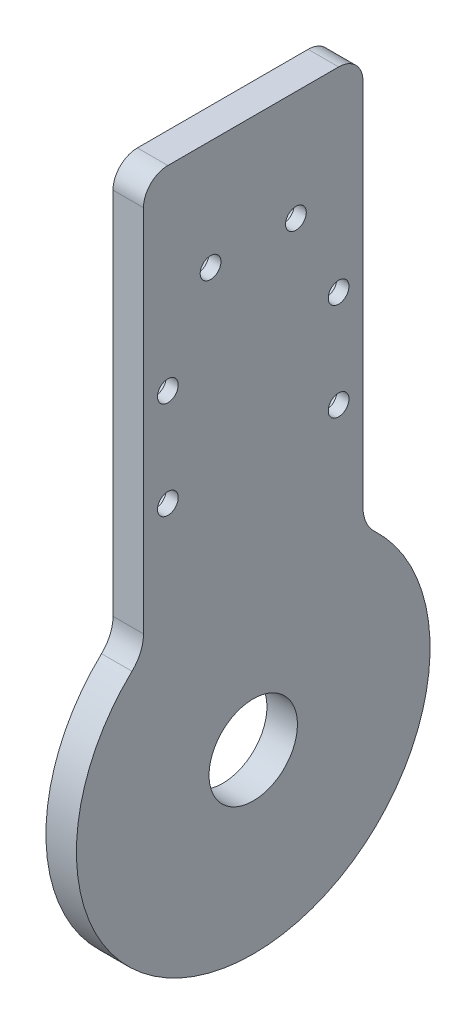
ISO-10303-21;
HEADER;
FILE_DESCRIPTION(('STEP AP214'),'2;1');
FILE_NAME('part.step','',(''),(''),'','','');
FILE_SCHEMA(('AUTOMOTIVE_DESIGN { 1 0 10303 214 1 1 1 1 }'));
ENDSEC;
DATA;
#1=APPLICATION_CONTEXT('core data for automotive mechanical design processes');
#2=APPLICATION_PROTOCOL_DEFINITION('international standard','automotive_design',2000,#1);
#3=PRODUCT_CONTEXT('',#1,'mechanical');
#4=PRODUCT('Part','Part','',(#3));
#5=PRODUCT_RELATED_PRODUCT_CATEGORY('part','',(#4));
#6=PRODUCT_DEFINITION_FORMATION('','',#4);
#7=PRODUCT_DEFINITION_CONTEXT('part definition',#1,'design');
#8=PRODUCT_DEFINITION('design','',#6,#7);
#9=PRODUCT_DEFINITION_SHAPE('','',#8);
#10=(LENGTH_UNIT() NAMED_UNIT(*) SI_UNIT(.MILLI.,.METRE.));
#11=(NAMED_UNIT(*) PLANE_ANGLE_UNIT() SI_UNIT($,.RADIAN.));
#12=(NAMED_UNIT(*) SI_UNIT($,.STERADIAN.) SOLID_ANGLE_UNIT());
#13=UNCERTAINTY_MEASURE_WITH_UNIT(LENGTH_MEASURE(1.E-05),#10,'distance_accuracy_value','');
#14=(GEOMETRIC_REPRESENTATION_CONTEXT(3) GLOBAL_UNCERTAINTY_ASSIGNED_CONTEXT((#13)) GLOBAL_UNIT_ASSIGNED_CONTEXT((#10,
#11,#12)) REPRESENTATION_CONTEXT('',''));
#15=CARTESIAN_POINT('',(0.,0.,0.));
#16=DIRECTION('',(0.,0.,1.));
#17=DIRECTION('',(1.,0.,0.));
#18=AXIS2_PLACEMENT_3D('',#15,#16,#17);
#19=CARTESIAN_POINT('',(-28.55,227.975478405714,-10.));
#20=DIRECTION('',(1.,0.,0.));
#21=DIRECTION('',(0.,0.,-1.));
#22=AXIS2_PLACEMENT_3D('',#19,#20,#21);
#23=PLANE('',#22);
#24=CARTESIAN_POINT('',(-28.55,274.5,7.));
#25=DIRECTION('',(1.,0.,0.));
#26=DIRECTION('',(0.,0.,-1.));
#27=AXIS2_PLACEMENT_3D('',#24,#25,#26);
#28=CIRCLE('',#27,1.7);
#29=CARTESIAN_POINT('',(-28.55,274.5,5.3));
#30=VERTEX_POINT('',#29);
#31=EDGE_CURVE('E225',#30,#30,#28,.F.);
#32=ORIENTED_EDGE('',*,*,#31,.T.);
#33=EDGE_LOOP('',(#32));
#34=FACE_BOUND('',#33,.T.);
#35=CARTESIAN_POINT('',(-28.55,260.5,28.));
#36=DIRECTION('',(1.,0.,0.));
#37=DIRECTION('',(0.,0.,-1.));
#38=AXIS2_PLACEMENT_3D('',#35,#36,#37);
#39=CIRCLE('',#38,1.7);
#40=CARTESIAN_POINT('',(-28.55,260.5,26.3));
#41=VERTEX_POINT('',#40);
#42=EDGE_CURVE('E218',#41,#41,#39,.F.);
#43=ORIENTED_EDGE('',*,*,#42,.T.);
#44=EDGE_LOOP('',(#43));
#45=FACE_BOUND('',#44,.T.);
#46=CARTESIAN_POINT('',(-28.55,260.5,0.));
#47=DIRECTION('',(1.,0.,0.));
#48=DIRECTION('',(0.,0.,-1.));
#49=AXIS2_PLACEMENT_3D('',#46,#47,#48);
#50=CIRCLE('',#49,1.7);
#51=CARTESIAN_POINT('',(-28.55,260.5,-1.7));
#52=VERTEX_POINT('',#51);
#53=EDGE_CURVE('E216',#52,#52,#50,.F.);
#54=ORIENTED_EDGE('',*,*,#53,.T.);
#55=EDGE_LOOP('',(#54));
#56=FACE_BOUND('',#55,.T.);
#57=CARTESIAN_POINT('',(-28.55,244.5,28.));
#58=DIRECTION('',(1.,0.,0.));
#59=DIRECTION('',(0.,0.,-1.));
#60=AXIS2_PLACEMENT_3D('',#57,#58,#59);
#61=CIRCLE('',#60,1.7);
#62=CARTESIAN_POINT('',(-28.55,244.5,26.3));
#63=VERTEX_POINT('',#62);
#64=EDGE_CURVE('E207',#63,#63,#61,.F.);
#65=ORIENTED_EDGE('',*,*,#64,.T.);
#66=EDGE_LOOP('',(#65));
#67=FACE_BOUND('',#66,.T.);
#68=CARTESIAN_POINT('',(-28.55,274.5,21.));
#69=DIRECTION('',(1.,0.,0.));
#70=DIRECTION('',(0.,0.,-1.));
#71=AXIS2_PLACEMENT_3D('',#68,#69,#70);
#72=CIRCLE('',#71,1.7);
#73=CARTESIAN_POINT('',(-28.55,274.5,19.3));
#74=VERTEX_POINT('',#73);
#75=EDGE_CURVE('E204',#74,#74,#72,.F.);
#76=ORIENTED_EDGE('',*,*,#75,.T.);
#77=EDGE_LOOP('',(#76));
#78=FACE_BOUND('',#77,.T.);
#79=CARTESIAN_POINT('',(-28.55,244.5,0.));
#80=DIRECTION('',(1.,0.,0.));
#81=DIRECTION('',(0.,0.,-1.));
#82=AXIS2_PLACEMENT_3D('',#79,#80,#81);
#83=CIRCLE('',#82,1.7);
#84=CARTESIAN_POINT('',(-28.55,244.5,-1.7));
#85=VERTEX_POINT('',#84);
#86=EDGE_CURVE('E199',#85,#85,#83,.F.);
#87=ORIENTED_EDGE('',*,*,#86,.T.);
#88=EDGE_LOOP('',(#87));
#89=FACE_BOUND('',#88,.T.);
#90=CARTESIAN_POINT('',(-28.55,227.975478405714,-10.));
#91=DIRECTION('',(-1.,0.,0.));
#92=DIRECTION('',(0.,0.,-1.));
#93=AXIS2_PLACEMENT_3D('',#90,#91,#92);
#94=CIRCLE('',#93,6.);
#95=CARTESIAN_POINT('',(-28.55,223.608253536163,-5.88571428571428));
#96=VERTEX_POINT('',#95);
#97=CARTESIAN_POINT('',(-28.55,227.975478405714,-4.));
#98=VERTEX_POINT('',#97);
#99=EDGE_CURVE('E153',#96,#98,#94,.T.);
#100=ORIENTED_EDGE('',*,*,#99,.T.);
#101=DIRECTION('',(0.,1.,0.));
#102=VECTOR('',#101,1.);
#103=CARTESIAN_POINT('',(-28.55,288.5,-4.));
#104=LINE('',#103,#102);
#105=CARTESIAN_POINT('',(-28.55,288.5,-4.));
#106=VERTEX_POINT('',#105);
#107=EDGE_CURVE('E101',#98,#106,#104,.T.);
#108=ORIENTED_EDGE('',*,*,#107,.T.);
#109=CARTESIAN_POINT('',(-28.55,288.5,0.));
#110=DIRECTION('',(1.,0.,0.));
#111=DIRECTION('',(0.,0.,1.));
#112=AXIS2_PLACEMENT_3D('',#109,#110,#111);
#113=CIRCLE('',#112,4.);
#114=CARTESIAN_POINT('',(-28.55,292.5,0.));
#115=VERTEX_POINT('',#114);
#116=EDGE_CURVE('E235',#106,#115,#113,.T.);
#117=ORIENTED_EDGE('',*,*,#116,.T.);
#118=DIRECTION('',(0.,0.,1.));
#119=VECTOR('',#118,1.);
#120=CARTESIAN_POINT('',(-28.55,292.5,28.));
#121=LINE('',#120,#119);
#122=CARTESIAN_POINT('',(-28.55,292.5,28.));
#123=VERTEX_POINT('',#122);
#124=EDGE_CURVE('E233',#115,#123,#121,.T.);
#125=ORIENTED_EDGE('',*,*,#124,.T.);
#126=CARTESIAN_POINT('',(-28.55,288.5,28.));
#127=DIRECTION('',(1.,0.,0.));
#128=DIRECTION('',(0.,0.,1.));
#129=AXIS2_PLACEMENT_3D('',#126,#127,#128);
#130=CIRCLE('',#129,4.);
#131=CARTESIAN_POINT('',(-28.55,288.5,32.));
#132=VERTEX_POINT('',#131);
#133=EDGE_CURVE('E118',#123,#132,#130,.T.);
#134=ORIENTED_EDGE('',*,*,#133,.T.);
#135=DIRECTION('',(0.,-1.,0.));
#136=VECTOR('',#135,1.);
#137=CARTESIAN_POINT('',(-28.55,227.975478405714,32.));
#138=LINE('',#137,#136);
#139=CARTESIAN_POINT('',(-28.55,227.975478405714,32.));
#140=VERTEX_POINT('',#139);
#141=EDGE_CURVE('E111',#132,#140,#138,.T.);
#142=ORIENTED_EDGE('',*,*,#141,.T.);
#143=CARTESIAN_POINT('',(-28.55,227.975478405714,38.));
#144=DIRECTION('',(-1.,0.,0.));
#145=DIRECTION('',(0.,0.,-1.));
#146=AXIS2_PLACEMENT_3D('',#143,#144,#145);
#147=CIRCLE('',#146,6.);
#148=CARTESIAN_POINT('',(-28.55,223.608253536163,33.8857142857143));
#149=VERTEX_POINT('',#148);
#150=EDGE_CURVE('E119',#140,#149,#147,.T.);
#151=ORIENTED_EDGE('',*,*,#150,.T.);
#152=CARTESIAN_POINT('',(-28.55,202.5,14.));
#153=DIRECTION('',(1.,0.,0.));
#154=DIRECTION('',(0.,0.,1.));
#155=AXIS2_PLACEMENT_3D('',#152,#153,#154);
#156=CIRCLE('',#155,29.);
#157=EDGE_CURVE('E59',#149,#96,#156,.T.);
#158=ORIENTED_EDGE('',*,*,#157,.T.);
#159=EDGE_LOOP('',(#100,#108,#117,#125,#134,#142,#151,#158));
#160=FACE_BOUND('',#159,.T.);
#161=CARTESIAN_POINT('',(-28.55,202.5,14.));
#162=DIRECTION('',(1.,0.,0.));
#163=DIRECTION('',(0.,0.,-1.));
#164=AXIS2_PLACEMENT_3D('',#161,#162,#163);
#165=CIRCLE('',#164,7.25);
#166=CARTESIAN_POINT('',(-28.55,202.5,6.75));
#167=VERTEX_POINT('',#166);
#168=EDGE_CURVE('E142',#167,#167,#165,.T.);
#169=ORIENTED_EDGE('',*,*,#168,.F.);
#170=EDGE_LOOP('',(#169));
#171=FACE_BOUND('',#170,.T.);
#172=ADVANCED_FACE('F39',(#34,#45,#56,#67,#78,#89,#160,#171),#23,.T.);
#173=CARTESIAN_POINT('',(-33.55,227.975478405714,-10.));
#174=DIRECTION('',(1.,0.,0.));
#175=DIRECTION('',(0.,0.,-1.));
#176=AXIS2_PLACEMENT_3D('',#173,#174,#175);
#177=PLANE('',#176);
#178=CARTESIAN_POINT('',(-33.55,274.5,7.));
#179=DIRECTION('',(1.,0.,0.));
#180=DIRECTION('',(0.,0.,-1.));
#181=AXIS2_PLACEMENT_3D('',#178,#179,#180);
#182=CIRCLE('',#181,3.2);
#183=CARTESIAN_POINT('',(-33.55,274.5,3.8));
#184=VERTEX_POINT('',#183);
#185=EDGE_CURVE('E43',#184,#184,#182,.F.);
#186=ORIENTED_EDGE('',*,*,#185,.F.);
#187=EDGE_LOOP('',(#186));
#188=FACE_BOUND('',#187,.T.);
#189=CARTESIAN_POINT('',(-33.55,260.5,28.));
#190=DIRECTION('',(1.,0.,0.));
#191=DIRECTION('',(0.,0.,-1.));
#192=AXIS2_PLACEMENT_3D('',#189,#190,#191);
#193=CIRCLE('',#192,3.2);
#194=CARTESIAN_POINT('',(-33.55,260.5,24.8));
#195=VERTEX_POINT('',#194);
#196=EDGE_CURVE('E194',#195,#195,#193,.F.);
#197=ORIENTED_EDGE('',*,*,#196,.F.);
#198=EDGE_LOOP('',(#197));
#199=FACE_BOUND('',#198,.T.);
#200=CARTESIAN_POINT('',(-33.55,260.5,0.));
#201=DIRECTION('',(1.,0.,0.));
#202=DIRECTION('',(0.,0.,-1.));
#203=AXIS2_PLACEMENT_3D('',#200,#201,#202);
#204=CIRCLE('',#203,3.2);
#205=CARTESIAN_POINT('',(-33.55,260.5,-3.2));
#206=VERTEX_POINT('',#205);
#207=EDGE_CURVE('E192',#206,#206,#204,.F.);
#208=ORIENTED_EDGE('',*,*,#207,.F.);
#209=EDGE_LOOP('',(#208));
#210=FACE_BOUND('',#209,.T.);
#211=CARTESIAN_POINT('',(-33.55,244.5,28.));
#212=DIRECTION('',(1.,0.,0.));
#213=DIRECTION('',(0.,0.,-1.));
#214=AXIS2_PLACEMENT_3D('',#211,#212,#213);
#215=CIRCLE('',#214,3.2);
#216=CARTESIAN_POINT('',(-33.55,244.5,24.8));
#217=VERTEX_POINT('',#216);
#218=EDGE_CURVE('E188',#217,#217,#215,.F.);
#219=ORIENTED_EDGE('',*,*,#218,.F.);
#220=EDGE_LOOP('',(#219));
#221=FACE_BOUND('',#220,.T.);
#222=CARTESIAN_POINT('',(-33.55,274.5,21.));
#223=DIRECTION('',(1.,0.,0.));
#224=DIRECTION('',(0.,0.,-1.));
#225=AXIS2_PLACEMENT_3D('',#222,#223,#224);
#226=CIRCLE('',#225,3.2);
#227=CARTESIAN_POINT('',(-33.55,274.5,17.8));
#228=VERTEX_POINT('',#227);
#229=EDGE_CURVE('E190',#228,#228,#226,.F.);
#230=ORIENTED_EDGE('',*,*,#229,.F.);
#231=EDGE_LOOP('',(#230));
#232=FACE_BOUND('',#231,.T.);
#233=CARTESIAN_POINT('',(-33.55,244.5,0.));
#234=DIRECTION('',(1.,0.,0.));
#235=DIRECTION('',(0.,0.,-1.));
#236=AXIS2_PLACEMENT_3D('',#233,#234,#235);
#237=CIRCLE('',#236,3.2);
#238=CARTESIAN_POINT('',(-33.55,244.5,-3.2));
#239=VERTEX_POINT('',#238);
#240=EDGE_CURVE('E184',#239,#239,#237,.F.);
#241=ORIENTED_EDGE('',*,*,#240,.F.);
#242=EDGE_LOOP('',(#241));
#243=FACE_BOUND('',#242,.T.);
#244=CARTESIAN_POINT('',(-33.55,227.975478405714,-10.));
#245=DIRECTION('',(-1.,0.,0.));
#246=DIRECTION('',(0.,0.,-1.));
#247=AXIS2_PLACEMENT_3D('',#244,#245,#246);
#248=CIRCLE('',#247,6.);
#249=CARTESIAN_POINT('',(-33.55,223.608253536163,-5.88571428571428));
#250=VERTEX_POINT('',#249);
#251=CARTESIAN_POINT('',(-33.55,227.975478405714,-4.));
#252=VERTEX_POINT('',#251);
#253=EDGE_CURVE('E137',#250,#252,#248,.T.);
#254=ORIENTED_EDGE('',*,*,#253,.F.);
#255=CARTESIAN_POINT('',(-33.55,202.5,14.));
#256=DIRECTION('',(1.,0.,0.));
#257=DIRECTION('',(0.,0.,1.));
#258=AXIS2_PLACEMENT_3D('',#255,#256,#257);
#259=CIRCLE('',#258,29.);
#260=CARTESIAN_POINT('',(-33.55,223.608253536163,33.8857142857143));
#261=VERTEX_POINT('',#260);
#262=EDGE_CURVE('E91',#261,#250,#259,.T.);
#263=ORIENTED_EDGE('',*,*,#262,.F.);
#264=CARTESIAN_POINT('',(-33.55,227.975478405714,38.));
#265=DIRECTION('',(-1.,0.,0.));
#266=DIRECTION('',(0.,0.,-1.));
#267=AXIS2_PLACEMENT_3D('',#264,#265,#266);
#268=CIRCLE('',#267,6.);
#269=CARTESIAN_POINT('',(-33.55,227.975478405714,32.));
#270=VERTEX_POINT('',#269);
#271=EDGE_CURVE('E87',#270,#261,#268,.T.);
#272=ORIENTED_EDGE('',*,*,#271,.F.);
#273=DIRECTION('',(0.,-1.,0.));
#274=VECTOR('',#273,1.);
#275=CARTESIAN_POINT('',(-33.55,227.975478405714,32.));
#276=LINE('',#275,#274);
#277=CARTESIAN_POINT('',(-33.55,288.5,32.));
#278=VERTEX_POINT('',#277);
#279=EDGE_CURVE('E126',#278,#270,#276,.T.);
#280=ORIENTED_EDGE('',*,*,#279,.F.);
#281=CARTESIAN_POINT('',(-33.55,288.5,28.));
#282=DIRECTION('',(1.,0.,0.));
#283=DIRECTION('',(0.,0.,1.));
#284=AXIS2_PLACEMENT_3D('',#281,#282,#283);
#285=CIRCLE('',#284,4.);
#286=CARTESIAN_POINT('',(-33.55,292.5,28.));
#287=VERTEX_POINT('',#286);
#288=EDGE_CURVE('E146',#287,#278,#285,.T.);
#289=ORIENTED_EDGE('',*,*,#288,.F.);
#290=DIRECTION('',(0.,0.,1.));
#291=VECTOR('',#290,1.);
#292=CARTESIAN_POINT('',(-33.55,292.5,28.));
#293=LINE('',#292,#291);
#294=CARTESIAN_POINT('',(-33.55,292.5,0.));
#295=VERTEX_POINT('',#294);
#296=EDGE_CURVE('E148',#295,#287,#293,.T.);
#297=ORIENTED_EDGE('',*,*,#296,.F.);
#298=CARTESIAN_POINT('',(-33.55,288.5,0.));
#299=DIRECTION('',(1.,0.,0.));
#300=DIRECTION('',(0.,0.,1.));
#301=AXIS2_PLACEMENT_3D('',#298,#299,#300);
#302=CIRCLE('',#301,4.);
#303=CARTESIAN_POINT('',(-33.55,288.5,-4.));
#304=VERTEX_POINT('',#303);
#305=EDGE_CURVE('E145',#304,#295,#302,.T.);
#306=ORIENTED_EDGE('',*,*,#305,.F.);
#307=DIRECTION('',(0.,1.,0.));
#308=VECTOR('',#307,1.);
#309=CARTESIAN_POINT('',(-33.55,288.5,-4.));
#310=LINE('',#309,#308);
#311=EDGE_CURVE('E143',#252,#304,#310,.T.);
#312=ORIENTED_EDGE('',*,*,#311,.F.);
#313=EDGE_LOOP('',(#254,#263,#272,#280,#289,#297,#306,#312));
#314=FACE_BOUND('',#313,.T.);
#315=CARTESIAN_POINT('',(-33.55,202.5,14.));
#316=DIRECTION('',(1.,0.,0.));
#317=DIRECTION('',(0.,0.,-1.));
#318=AXIS2_PLACEMENT_3D('',#315,#316,#317);
#319=CIRCLE('',#318,7.25);
#320=CARTESIAN_POINT('',(-33.55,202.5,6.75));
#321=VERTEX_POINT('',#320);
#322=EDGE_CURVE('E223',#321,#321,#319,.T.);
#323=ORIENTED_EDGE('',*,*,#322,.T.);
#324=EDGE_LOOP('',(#323));
#325=FACE_BOUND('',#324,.T.);
#326=ADVANCED_FACE('F250',(#188,#199,#210,#221,#232,#243,#314,#325),#177,.F.);
#327=CARTESIAN_POINT('',(-28.55,227.975478405714,-10.));
#328=DIRECTION('',(-1.,0.,0.));
#329=DIRECTION('',(0.,0.,1.));
#330=AXIS2_PLACEMENT_3D('',#327,#328,#329);
#331=CYLINDRICAL_SURFACE('',#330,6.);
#332=ORIENTED_EDGE('',*,*,#253,.T.);
#333=DIRECTION('',(-1.,0.,0.));
#334=VECTOR('',#333,1.);
#335=CARTESIAN_POINT('',(-28.55,227.975478405714,-4.));
#336=LINE('',#335,#334);
#337=EDGE_CURVE('E11',#98,#252,#336,.T.);
#338=ORIENTED_EDGE('',*,*,#337,.F.);
#339=ORIENTED_EDGE('',*,*,#99,.F.);
#340=DIRECTION('',(-1.,0.,0.));
#341=VECTOR('',#340,1.);
#342=CARTESIAN_POINT('',(-28.55,223.608253536163,-5.88571428571428));
#343=LINE('',#342,#341);
#344=EDGE_CURVE('E131',#96,#250,#343,.T.);
#345=ORIENTED_EDGE('',*,*,#344,.T.);
#346=EDGE_LOOP('',(#332,#338,#339,#345));
#347=FACE_BOUND('',#346,.T.);
#348=ADVANCED_FACE('F41',(#347),#331,.F.);
#349=CARTESIAN_POINT('',(-28.55,288.5,-4.));
#350=DIRECTION('',(0.,0.,1.));
#351=DIRECTION('',(1.,0.,0.));
#352=AXIS2_PLACEMENT_3D('',#349,#350,#351);
#353=PLANE('',#352);
#354=ORIENTED_EDGE('',*,*,#311,.T.);
#355=DIRECTION('',(-1.,0.,0.));
#356=VECTOR('',#355,1.);
#357=CARTESIAN_POINT('',(-28.55,288.5,-4.));
#358=LINE('',#357,#356);
#359=EDGE_CURVE('E47',#106,#304,#358,.T.);
#360=ORIENTED_EDGE('',*,*,#359,.F.);
#361=ORIENTED_EDGE('',*,*,#107,.F.);
#362=ORIENTED_EDGE('',*,*,#337,.T.);
#363=EDGE_LOOP('',(#354,#360,#361,#362));
#364=FACE_BOUND('',#363,.T.);
#365=ADVANCED_FACE('F518',(#364),#353,.F.);
#366=CARTESIAN_POINT('',(-28.55,288.5,0.));
#367=DIRECTION('',(-1.,0.,0.));
#368=DIRECTION('',(0.,0.,1.));
#369=AXIS2_PLACEMENT_3D('',#366,#367,#368);
#370=CYLINDRICAL_SURFACE('',#369,4.);
#371=ORIENTED_EDGE('',*,*,#305,.T.);
#372=DIRECTION('',(-1.,0.,0.));
#373=VECTOR('',#372,1.);
#374=CARTESIAN_POINT('',(-28.55,292.5,0.));
#375=LINE('',#374,#373);
#376=EDGE_CURVE('E159',#115,#295,#375,.T.);
#377=ORIENTED_EDGE('',*,*,#376,.F.);
#378=ORIENTED_EDGE('',*,*,#116,.F.);
#379=ORIENTED_EDGE('',*,*,#359,.T.);
#380=EDGE_LOOP('',(#371,#377,#378,#379));
#381=FACE_BOUND('',#380,.T.);
#382=ADVANCED_FACE('F515',(#381),#370,.T.);
#383=CARTESIAN_POINT('',(-28.55,292.5,28.));
#384=DIRECTION('',(0.,-1.,0.));
#385=DIRECTION('',(0.,0.,-1.));
#386=AXIS2_PLACEMENT_3D('',#383,#384,#385);
#387=PLANE('',#386);
#388=ORIENTED_EDGE('',*,*,#296,.T.);
#389=DIRECTION('',(-1.,0.,0.));
#390=VECTOR('',#389,1.);
#391=CARTESIAN_POINT('',(-28.55,292.5,28.));
#392=LINE('',#391,#390);
#393=EDGE_CURVE('E160',#123,#287,#392,.T.);
#394=ORIENTED_EDGE('',*,*,#393,.F.);
#395=ORIENTED_EDGE('',*,*,#124,.F.);
#396=ORIENTED_EDGE('',*,*,#376,.T.);
#397=EDGE_LOOP('',(#388,#394,#395,#396));
#398=FACE_BOUND('',#397,.T.);
#399=ADVANCED_FACE('F238',(#398),#387,.F.);
#400=CARTESIAN_POINT('',(-28.55,288.5,28.));
#401=DIRECTION('',(-1.,0.,0.));
#402=DIRECTION('',(0.,0.,1.));
#403=AXIS2_PLACEMENT_3D('',#400,#401,#402);
#404=CYLINDRICAL_SURFACE('',#403,4.);
#405=ORIENTED_EDGE('',*,*,#288,.T.);
#406=DIRECTION('',(-1.,0.,0.));
#407=VECTOR('',#406,1.);
#408=CARTESIAN_POINT('',(-28.55,288.5,32.));
#409=LINE('',#408,#407);
#410=EDGE_CURVE('E129',#132,#278,#409,.T.);
#411=ORIENTED_EDGE('',*,*,#410,.F.);
#412=ORIENTED_EDGE('',*,*,#133,.F.);
#413=ORIENTED_EDGE('',*,*,#393,.T.);
#414=EDGE_LOOP('',(#405,#411,#412,#413));
#415=FACE_BOUND('',#414,.T.);
#416=ADVANCED_FACE('F241',(#415),#404,.T.);
#417=CARTESIAN_POINT('',(-28.55,227.975478405714,32.));
#418=DIRECTION('',(0.,0.,-1.));
#419=DIRECTION('',(-1.,0.,0.));
#420=AXIS2_PLACEMENT_3D('',#417,#418,#419);
#421=PLANE('',#420);
#422=ORIENTED_EDGE('',*,*,#279,.T.);
#423=DIRECTION('',(-1.,0.,0.));
#424=VECTOR('',#423,1.);
#425=CARTESIAN_POINT('',(-28.55,227.975478405714,32.));
#426=LINE('',#425,#424);
#427=EDGE_CURVE('E124',#140,#270,#426,.T.);
#428=ORIENTED_EDGE('',*,*,#427,.F.);
#429=ORIENTED_EDGE('',*,*,#141,.F.);
#430=ORIENTED_EDGE('',*,*,#410,.T.);
#431=EDGE_LOOP('',(#422,#428,#429,#430));
#432=FACE_BOUND('',#431,.T.);
#433=ADVANCED_FACE('F127',(#432),#421,.F.);
#434=CARTESIAN_POINT('',(-28.55,227.975478405714,38.));
#435=DIRECTION('',(-1.,0.,0.));
#436=DIRECTION('',(0.,0.,1.));
#437=AXIS2_PLACEMENT_3D('',#434,#435,#436);
#438=CYLINDRICAL_SURFACE('',#437,6.);
#439=ORIENTED_EDGE('',*,*,#271,.T.);
#440=DIRECTION('',(-1.,0.,0.));
#441=VECTOR('',#440,1.);
#442=CARTESIAN_POINT('',(-28.55,223.608253536163,33.8857142857143));
#443=LINE('',#442,#441);
#444=EDGE_CURVE('E128',#149,#261,#443,.T.);
#445=ORIENTED_EDGE('',*,*,#444,.F.);
#446=ORIENTED_EDGE('',*,*,#150,.F.);
#447=ORIENTED_EDGE('',*,*,#427,.T.);
#448=EDGE_LOOP('',(#439,#445,#446,#447));
#449=FACE_BOUND('',#448,.T.);
#450=ADVANCED_FACE('F135',(#449),#438,.F.);
#451=CARTESIAN_POINT('',(-28.55,202.5,14.));
#452=DIRECTION('',(-1.,0.,0.));
#453=DIRECTION('',(0.,0.,1.));
#454=AXIS2_PLACEMENT_3D('',#451,#452,#453);
#455=CYLINDRICAL_SURFACE('',#454,29.);
#456=ORIENTED_EDGE('',*,*,#262,.T.);
#457=ORIENTED_EDGE('',*,*,#344,.F.);
#458=ORIENTED_EDGE('',*,*,#157,.F.);
#459=ORIENTED_EDGE('',*,*,#444,.T.);
#460=EDGE_LOOP('',(#456,#457,#458,#459));
#461=FACE_BOUND('',#460,.T.);
#462=ADVANCED_FACE('F251',(#461),#455,.T.);
#463=CARTESIAN_POINT('',(-28.55,202.5,14.));
#464=DIRECTION('',(-1.,0.,0.));
#465=DIRECTION('',(0.,0.,1.));
#466=AXIS2_PLACEMENT_3D('',#463,#464,#465);
#467=CYLINDRICAL_SURFACE('',#466,7.25);
#468=ORIENTED_EDGE('',*,*,#168,.T.);
#469=EDGE_LOOP('',(#468));
#470=FACE_BOUND('',#469,.T.);
#471=ORIENTED_EDGE('',*,*,#322,.F.);
#472=EDGE_LOOP('',(#471));
#473=FACE_BOUND('',#472,.T.);
#474=ADVANCED_FACE('F254',(#470,#473),#467,.F.);
#475=CARTESIAN_POINT('',(-28.35,244.5,0.));
#476=DIRECTION('',(-1.,0.,0.));
#477=DIRECTION('',(0.,0.,1.));
#478=AXIS2_PLACEMENT_3D('',#475,#476,#477);
#479=CYLINDRICAL_SURFACE('',#478,1.7);
#480=CARTESIAN_POINT('',(-30.55,244.5,0.));
#481=DIRECTION('',(1.,0.,0.));
#482=DIRECTION('',(0.,0.,-1.));
#483=AXIS2_PLACEMENT_3D('',#480,#481,#482);
#484=CIRCLE('',#483,1.7);
#485=CARTESIAN_POINT('',(-30.55,244.5,-1.7));
#486=VERTEX_POINT('',#485);
#487=EDGE_CURVE('E182',#486,#486,#484,.T.);
#488=ORIENTED_EDGE('',*,*,#487,.F.);
#489=EDGE_LOOP('',(#488));
#490=FACE_BOUND('',#489,.T.);
#491=ORIENTED_EDGE('',*,*,#86,.F.);
#492=EDGE_LOOP('',(#491));
#493=FACE_BOUND('',#492,.T.);
#494=ADVANCED_FACE('F261',(#490,#493),#479,.F.);
#495=CARTESIAN_POINT('',(-28.35,274.5,21.));
#496=DIRECTION('',(-1.,0.,0.));
#497=DIRECTION('',(0.,0.,1.));
#498=AXIS2_PLACEMENT_3D('',#495,#496,#497);
#499=CYLINDRICAL_SURFACE('',#498,1.7);
#500=CARTESIAN_POINT('',(-30.55,274.5,21.));
#501=DIRECTION('',(1.,0.,0.));
#502=DIRECTION('',(0.,0.,-1.));
#503=AXIS2_PLACEMENT_3D('',#500,#501,#502);
#504=CIRCLE('',#503,1.7);
#505=CARTESIAN_POINT('',(-30.55,274.5,19.3));
#506=VERTEX_POINT('',#505);
#507=EDGE_CURVE('E177',#506,#506,#504,.T.);
#508=ORIENTED_EDGE('',*,*,#507,.F.);
#509=EDGE_LOOP('',(#508));
#510=FACE_BOUND('',#509,.T.);
#511=ORIENTED_EDGE('',*,*,#75,.F.);
#512=EDGE_LOOP('',(#511));
#513=FACE_BOUND('',#512,.T.);
#514=ADVANCED_FACE('F280',(#510,#513),#499,.F.);
#515=CARTESIAN_POINT('',(-28.35,244.5,28.));
#516=DIRECTION('',(-1.,0.,0.));
#517=DIRECTION('',(0.,0.,1.));
#518=AXIS2_PLACEMENT_3D('',#515,#516,#517);
#519=CYLINDRICAL_SURFACE('',#518,1.7);
#520=CARTESIAN_POINT('',(-30.55,244.5,28.));
#521=DIRECTION('',(1.,0.,0.));
#522=DIRECTION('',(0.,0.,-1.));
#523=AXIS2_PLACEMENT_3D('',#520,#521,#522);
#524=CIRCLE('',#523,1.7);
#525=CARTESIAN_POINT('',(-30.55,244.5,26.3));
#526=VERTEX_POINT('',#525);
#527=EDGE_CURVE('E173',#526,#526,#524,.T.);
#528=ORIENTED_EDGE('',*,*,#527,.F.);
#529=EDGE_LOOP('',(#528));
#530=FACE_BOUND('',#529,.T.);
#531=ORIENTED_EDGE('',*,*,#64,.F.);
#532=EDGE_LOOP('',(#531));
#533=FACE_BOUND('',#532,.T.);
#534=ADVANCED_FACE('F284',(#530,#533),#519,.F.);
#535=CARTESIAN_POINT('',(-28.35,260.5,0.));
#536=DIRECTION('',(-1.,0.,0.));
#537=DIRECTION('',(0.,0.,1.));
#538=AXIS2_PLACEMENT_3D('',#535,#536,#537);
#539=CYLINDRICAL_SURFACE('',#538,1.7);
#540=CARTESIAN_POINT('',(-30.55,260.5,0.));
#541=DIRECTION('',(1.,0.,0.));
#542=DIRECTION('',(0.,0.,-1.));
#543=AXIS2_PLACEMENT_3D('',#540,#541,#542);
#544=CIRCLE('',#543,1.7);
#545=CARTESIAN_POINT('',(-30.55,260.5,-1.7));
#546=VERTEX_POINT('',#545);
#547=EDGE_CURVE('E175',#546,#546,#544,.T.);
#548=ORIENTED_EDGE('',*,*,#547,.F.);
#549=EDGE_LOOP('',(#548));
#550=FACE_BOUND('',#549,.T.);
#551=ORIENTED_EDGE('',*,*,#53,.F.);
#552=EDGE_LOOP('',(#551));
#553=FACE_BOUND('',#552,.T.);
#554=ADVANCED_FACE('F276',(#550,#553),#539,.F.);
#555=CARTESIAN_POINT('',(-28.35,260.5,28.));
#556=DIRECTION('',(-1.,0.,0.));
#557=DIRECTION('',(0.,0.,1.));
#558=AXIS2_PLACEMENT_3D('',#555,#556,#557);
#559=CYLINDRICAL_SURFACE('',#558,1.7);
#560=CARTESIAN_POINT('',(-30.55,260.5,28.));
#561=DIRECTION('',(1.,0.,0.));
#562=DIRECTION('',(0.,0.,-1.));
#563=AXIS2_PLACEMENT_3D('',#560,#561,#562);
#564=CIRCLE('',#563,1.7);
#565=CARTESIAN_POINT('',(-30.55,260.5,26.3));
#566=VERTEX_POINT('',#565);
#567=EDGE_CURVE('E169',#566,#566,#564,.T.);
#568=ORIENTED_EDGE('',*,*,#567,.F.);
#569=EDGE_LOOP('',(#568));
#570=FACE_BOUND('',#569,.T.);
#571=ORIENTED_EDGE('',*,*,#42,.F.);
#572=EDGE_LOOP('',(#571));
#573=FACE_BOUND('',#572,.T.);
#574=ADVANCED_FACE('F285',(#570,#573),#559,.F.);
#575=CARTESIAN_POINT('',(-28.35,274.5,7.));
#576=DIRECTION('',(-1.,0.,0.));
#577=DIRECTION('',(0.,0.,1.));
#578=AXIS2_PLACEMENT_3D('',#575,#576,#577);
#579=CYLINDRICAL_SURFACE('',#578,1.7);
#580=CARTESIAN_POINT('',(-30.55,274.5,7.));
#581=DIRECTION('',(1.,0.,0.));
#582=DIRECTION('',(0.,0.,-1.));
#583=AXIS2_PLACEMENT_3D('',#580,#581,#582);
#584=CIRCLE('',#583,1.7);
#585=CARTESIAN_POINT('',(-30.55,274.5,5.3));
#586=VERTEX_POINT('',#585);
#587=EDGE_CURVE('E164',#586,#586,#584,.T.);
#588=ORIENTED_EDGE('',*,*,#587,.F.);
#589=EDGE_LOOP('',(#588));
#590=FACE_BOUND('',#589,.T.);
#591=ORIENTED_EDGE('',*,*,#31,.F.);
#592=EDGE_LOOP('',(#591));
#593=FACE_BOUND('',#592,.T.);
#594=ADVANCED_FACE('F287',(#590,#593),#579,.F.);
#595=CARTESIAN_POINT('',(-30.55,274.5,7.));
#596=DIRECTION('',(-1.,0.,0.));
#597=DIRECTION('',(0.,0.,1.));
#598=AXIS2_PLACEMENT_3D('',#595,#596,#597);
#599=CYLINDRICAL_SURFACE('',#598,3.2);
#600=CARTESIAN_POINT('',(-30.55,274.5,7.));
#601=DIRECTION('',(1.,0.,0.));
#602=DIRECTION('',(0.,0.,-1.));
#603=AXIS2_PLACEMENT_3D('',#600,#601,#602);
#604=CIRCLE('',#603,3.2);
#605=CARTESIAN_POINT('',(-30.55,274.5,3.8));
#606=VERTEX_POINT('',#605);
#607=EDGE_CURVE('E360',#606,#606,#604,.T.);
#608=ORIENTED_EDGE('',*,*,#607,.T.);
#609=EDGE_LOOP('',(#608));
#610=FACE_BOUND('',#609,.T.);
#611=ORIENTED_EDGE('',*,*,#185,.T.);
#612=EDGE_LOOP('',(#611));
#613=FACE_BOUND('',#612,.T.);
#614=ADVANCED_FACE('F292',(#610,#613),#599,.F.);
#615=CARTESIAN_POINT('',(-30.55,274.5,7.));
#616=DIRECTION('',(1.,0.,0.));
#617=DIRECTION('',(0.,0.,-1.));
#618=AXIS2_PLACEMENT_3D('',#615,#616,#617);
#619=PLANE('',#618);
#620=ORIENTED_EDGE('',*,*,#587,.T.);
#621=EDGE_LOOP('',(#620));
#622=FACE_BOUND('',#621,.T.);
#623=ORIENTED_EDGE('',*,*,#607,.F.);
#624=EDGE_LOOP('',(#623));
#625=FACE_BOUND('',#624,.T.);
#626=ADVANCED_FACE('F326',(#622,#625),#619,.F.);
#627=CARTESIAN_POINT('',(-30.55,260.5,28.));
#628=DIRECTION('',(-1.,0.,0.));
#629=DIRECTION('',(0.,0.,1.));
#630=AXIS2_PLACEMENT_3D('',#627,#628,#629);
#631=CYLINDRICAL_SURFACE('',#630,3.2);
#632=CARTESIAN_POINT('',(-30.55,260.5,28.));
#633=DIRECTION('',(1.,0.,0.));
#634=DIRECTION('',(0.,0.,-1.));
#635=AXIS2_PLACEMENT_3D('',#632,#633,#634);
#636=CIRCLE('',#635,3.2);
#637=CARTESIAN_POINT('',(-30.55,260.5,24.8));
#638=VERTEX_POINT('',#637);
#639=EDGE_CURVE('E359',#638,#638,#636,.T.);
#640=ORIENTED_EDGE('',*,*,#639,.T.);
#641=EDGE_LOOP('',(#640));
#642=FACE_BOUND('',#641,.T.);
#643=ORIENTED_EDGE('',*,*,#196,.T.);
#644=EDGE_LOOP('',(#643));
#645=FACE_BOUND('',#644,.T.);
#646=ADVANCED_FACE('F328',(#642,#645),#631,.F.);
#647=CARTESIAN_POINT('',(-30.55,260.5,28.));
#648=DIRECTION('',(1.,0.,0.));
#649=DIRECTION('',(0.,0.,-1.));
#650=AXIS2_PLACEMENT_3D('',#647,#648,#649);
#651=PLANE('',#650);
#652=ORIENTED_EDGE('',*,*,#567,.T.);
#653=EDGE_LOOP('',(#652));
#654=FACE_BOUND('',#653,.T.);
#655=ORIENTED_EDGE('',*,*,#639,.F.);
#656=EDGE_LOOP('',(#655));
#657=FACE_BOUND('',#656,.T.);
#658=ADVANCED_FACE('F316',(#654,#657),#651,.F.);
#659=CARTESIAN_POINT('',(-30.55,260.5,0.));
#660=DIRECTION('',(-1.,0.,0.));
#661=DIRECTION('',(0.,0.,1.));
#662=AXIS2_PLACEMENT_3D('',#659,#660,#661);
#663=CYLINDRICAL_SURFACE('',#662,3.2);
#664=CARTESIAN_POINT('',(-30.55,260.5,0.));
#665=DIRECTION('',(1.,0.,0.));
#666=DIRECTION('',(0.,0.,-1.));
#667=AXIS2_PLACEMENT_3D('',#664,#665,#666);
#668=CIRCLE('',#667,3.2);
#669=CARTESIAN_POINT('',(-30.55,260.5,-3.2));
#670=VERTEX_POINT('',#669);
#671=EDGE_CURVE('E365',#670,#670,#668,.T.);
#672=ORIENTED_EDGE('',*,*,#671,.T.);
#673=EDGE_LOOP('',(#672));
#674=FACE_BOUND('',#673,.T.);
#675=ORIENTED_EDGE('',*,*,#207,.T.);
#676=EDGE_LOOP('',(#675));
#677=FACE_BOUND('',#676,.T.);
#678=ADVANCED_FACE('F315',(#674,#677),#663,.F.);
#679=CARTESIAN_POINT('',(-30.55,260.5,0.));
#680=DIRECTION('',(1.,0.,0.));
#681=DIRECTION('',(0.,0.,-1.));
#682=AXIS2_PLACEMENT_3D('',#679,#680,#681);
#683=PLANE('',#682);
#684=ORIENTED_EDGE('',*,*,#547,.T.);
#685=EDGE_LOOP('',(#684));
#686=FACE_BOUND('',#685,.T.);
#687=ORIENTED_EDGE('',*,*,#671,.F.);
#688=EDGE_LOOP('',(#687));
#689=FACE_BOUND('',#688,.T.);
#690=ADVANCED_FACE('F306',(#686,#689),#683,.F.);
#691=CARTESIAN_POINT('',(-30.55,244.5,28.));
#692=DIRECTION('',(-1.,0.,0.));
#693=DIRECTION('',(0.,0.,1.));
#694=AXIS2_PLACEMENT_3D('',#691,#692,#693);
#695=CYLINDRICAL_SURFACE('',#694,3.2);
#696=CARTESIAN_POINT('',(-30.55,244.5,28.));
#697=DIRECTION('',(1.,0.,0.));
#698=DIRECTION('',(0.,0.,-1.));
#699=AXIS2_PLACEMENT_3D('',#696,#697,#698);
#700=CIRCLE('',#699,3.2);
#701=CARTESIAN_POINT('',(-30.55,244.5,24.8));
#702=VERTEX_POINT('',#701);
#703=EDGE_CURVE('E368',#702,#702,#700,.T.);
#704=ORIENTED_EDGE('',*,*,#703,.T.);
#705=EDGE_LOOP('',(#704));
#706=FACE_BOUND('',#705,.T.);
#707=ORIENTED_EDGE('',*,*,#218,.T.);
#708=EDGE_LOOP('',(#707));
#709=FACE_BOUND('',#708,.T.);
#710=ADVANCED_FACE('F313',(#706,#709),#695,.F.);
#711=CARTESIAN_POINT('',(-30.55,244.5,28.));
#712=DIRECTION('',(1.,0.,0.));
#713=DIRECTION('',(0.,0.,-1.));
#714=AXIS2_PLACEMENT_3D('',#711,#712,#713);
#715=PLANE('',#714);
#716=ORIENTED_EDGE('',*,*,#527,.T.);
#717=EDGE_LOOP('',(#716));
#718=FACE_BOUND('',#717,.T.);
#719=ORIENTED_EDGE('',*,*,#703,.F.);
#720=EDGE_LOOP('',(#719));
#721=FACE_BOUND('',#720,.T.);
#722=ADVANCED_FACE('F318',(#718,#721),#715,.F.);
#723=CARTESIAN_POINT('',(-30.55,274.5,21.));
#724=DIRECTION('',(-1.,0.,0.));
#725=DIRECTION('',(0.,0.,1.));
#726=AXIS2_PLACEMENT_3D('',#723,#724,#725);
#727=CYLINDRICAL_SURFACE('',#726,3.2);
#728=CARTESIAN_POINT('',(-30.55,274.5,21.));
#729=DIRECTION('',(1.,0.,0.));
#730=DIRECTION('',(0.,0.,-1.));
#731=AXIS2_PLACEMENT_3D('',#728,#729,#730);
#732=CIRCLE('',#731,3.2);
#733=CARTESIAN_POINT('',(-30.55,274.5,17.8));
#734=VERTEX_POINT('',#733);
#735=EDGE_CURVE('E348',#734,#734,#732,.T.);
#736=ORIENTED_EDGE('',*,*,#735,.T.);
#737=EDGE_LOOP('',(#736));
#738=FACE_BOUND('',#737,.T.);
#739=ORIENTED_EDGE('',*,*,#229,.T.);
#740=EDGE_LOOP('',(#739));
#741=FACE_BOUND('',#740,.T.);
#742=ADVANCED_FACE('F321',(#738,#741),#727,.F.);
#743=CARTESIAN_POINT('',(-30.55,274.5,21.));
#744=DIRECTION('',(1.,0.,0.));
#745=DIRECTION('',(0.,0.,-1.));
#746=AXIS2_PLACEMENT_3D('',#743,#744,#745);
#747=PLANE('',#746);
#748=ORIENTED_EDGE('',*,*,#507,.T.);
#749=EDGE_LOOP('',(#748));
#750=FACE_BOUND('',#749,.T.);
#751=ORIENTED_EDGE('',*,*,#735,.F.);
#752=EDGE_LOOP('',(#751));
#753=FACE_BOUND('',#752,.T.);
#754=ADVANCED_FACE('F302',(#750,#753),#747,.F.);
#755=CARTESIAN_POINT('',(-30.55,244.5,0.));
#756=DIRECTION('',(-1.,0.,0.));
#757=DIRECTION('',(0.,0.,1.));
#758=AXIS2_PLACEMENT_3D('',#755,#756,#757);
#759=CYLINDRICAL_SURFACE('',#758,3.2);
#760=CARTESIAN_POINT('',(-30.55,244.5,0.));
#761=DIRECTION('',(1.,0.,0.));
#762=DIRECTION('',(0.,0.,-1.));
#763=AXIS2_PLACEMENT_3D('',#760,#761,#762);
#764=CIRCLE('',#763,3.2);
#765=CARTESIAN_POINT('',(-30.55,244.5,-3.2));
#766=VERTEX_POINT('',#765);
#767=EDGE_CURVE('E166',#766,#766,#764,.T.);
#768=ORIENTED_EDGE('',*,*,#767,.T.);
#769=EDGE_LOOP('',(#768));
#770=FACE_BOUND('',#769,.T.);
#771=ORIENTED_EDGE('',*,*,#240,.T.);
#772=EDGE_LOOP('',(#771));
#773=FACE_BOUND('',#772,.T.);
#774=ADVANCED_FACE('F296',(#770,#773),#759,.F.);
#775=CARTESIAN_POINT('',(-30.55,244.5,0.));
#776=DIRECTION('',(1.,0.,0.));
#777=DIRECTION('',(0.,0.,-1.));
#778=AXIS2_PLACEMENT_3D('',#775,#776,#777);
#779=PLANE('',#778);
#780=ORIENTED_EDGE('',*,*,#487,.T.);
#781=EDGE_LOOP('',(#780));
#782=FACE_BOUND('',#781,.T.);
#783=ORIENTED_EDGE('',*,*,#767,.F.);
#784=EDGE_LOOP('',(#783));
#785=FACE_BOUND('',#784,.T.);
#786=ADVANCED_FACE('F305',(#782,#785),#779,.F.);
#787=CLOSED_SHELL('',(#172,#326,#348,#365,#382,#399,#416,#433,#450,#462,#474,#494,#514,#534,
#554,#574,#594,#614,#626,#646,#658,#678,#690,#710,#722,#742,#754,#774,#786));
#788=MANIFOLD_SOLID_BREP('B2',#787);
#789=ADVANCED_BREP_SHAPE_REPRESENTATION('',(#18,#788),#14);
#790=SHAPE_DEFINITION_REPRESENTATION(#9,#789);
ENDSEC;
END-ISO-10303-21;
